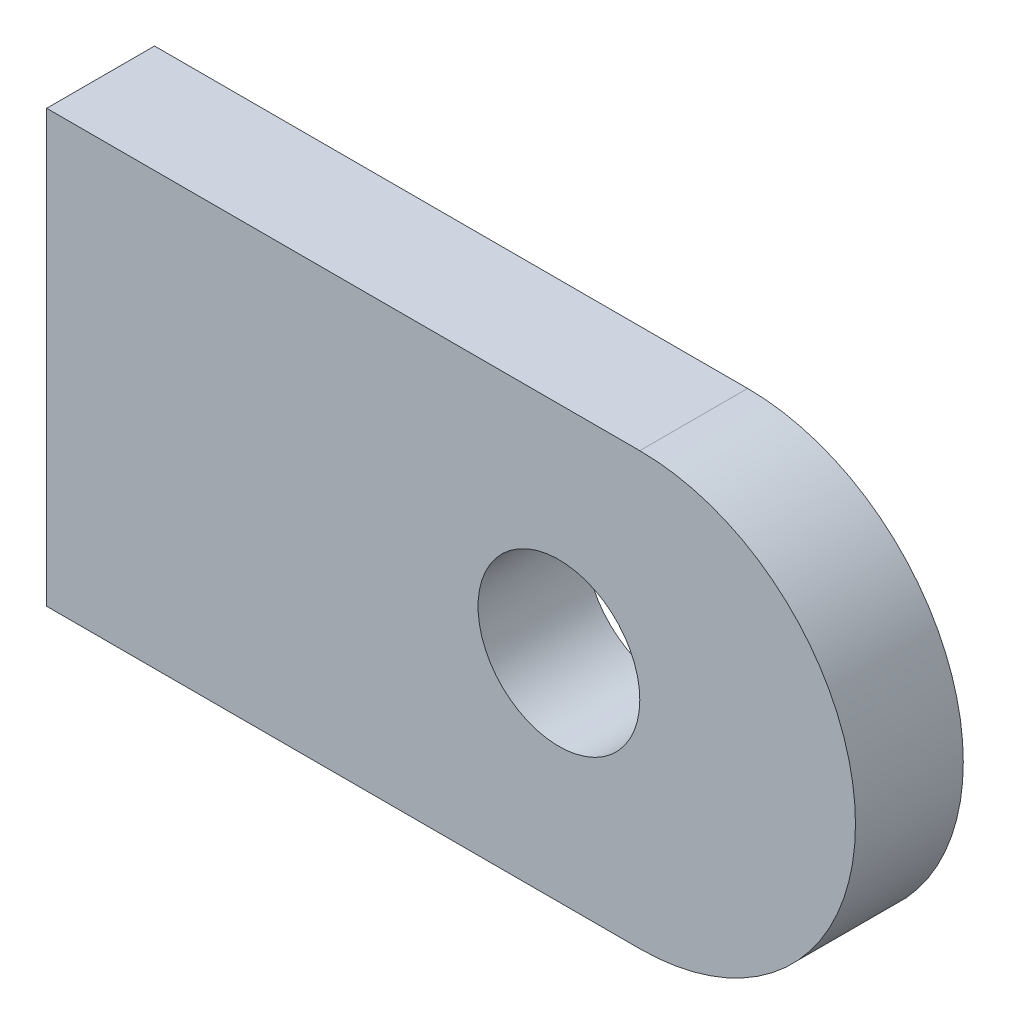
ISO-10303-21;
HEADER;
FILE_DESCRIPTION(('STEP AP214'),'2;1');
FILE_NAME('part.step','',(''),(''),'','','');
FILE_SCHEMA(('AUTOMOTIVE_DESIGN { 1 0 10303 214 1 1 1 1 }'));
ENDSEC;
DATA;
#1=APPLICATION_CONTEXT('core data for automotive mechanical design processes');
#2=APPLICATION_PROTOCOL_DEFINITION('international standard','automotive_design',2000,#1);
#3=PRODUCT_CONTEXT('',#1,'mechanical');
#4=PRODUCT('Part','Part','',(#3));
#5=PRODUCT_RELATED_PRODUCT_CATEGORY('part','',(#4));
#6=PRODUCT_DEFINITION_FORMATION('','',#4);
#7=PRODUCT_DEFINITION_CONTEXT('part definition',#1,'design');
#8=PRODUCT_DEFINITION('design','',#6,#7);
#9=PRODUCT_DEFINITION_SHAPE('','',#8);
#10=(LENGTH_UNIT() NAMED_UNIT(*) SI_UNIT(.MILLI.,.METRE.));
#11=(NAMED_UNIT(*) PLANE_ANGLE_UNIT() SI_UNIT($,.RADIAN.));
#12=(NAMED_UNIT(*) SI_UNIT($,.STERADIAN.) SOLID_ANGLE_UNIT());
#13=UNCERTAINTY_MEASURE_WITH_UNIT(LENGTH_MEASURE(1.E-05),#10,'distance_accuracy_value','');
#14=(GEOMETRIC_REPRESENTATION_CONTEXT(3) GLOBAL_UNCERTAINTY_ASSIGNED_CONTEXT((#13)) GLOBAL_UNIT_ASSIGNED_CONTEXT((#10,
#11,#12)) REPRESENTATION_CONTEXT('',''));
#15=CARTESIAN_POINT('',(0.,0.,0.));
#16=DIRECTION('',(0.,0.,1.));
#17=DIRECTION('',(1.,0.,0.));
#18=AXIS2_PLACEMENT_3D('',#15,#16,#17);
#19=CARTESIAN_POINT('',(0.,-200.,100.));
#20=DIRECTION('',(0.,-1.,0.));
#21=DIRECTION('',(1.,0.,0.));
#22=AXIS2_PLACEMENT_3D('',#19,#20,#21);
#23=PLANE('',#22);
#24=DIRECTION('',(-1.,0.,0.));
#25=VECTOR('',#24,1.);
#26=CARTESIAN_POINT('',(0.,-200.,0.));
#27=LINE('',#26,#25);
#28=CARTESIAN_POINT('',(275.,-200.,0.));
#29=VERTEX_POINT('',#28);
#30=CARTESIAN_POINT('',(-275.,-200.,0.));
#31=VERTEX_POINT('',#30);
#32=EDGE_CURVE('E121',#29,#31,#27,.T.);
#33=ORIENTED_EDGE('',*,*,#32,.F.);
#34=DIRECTION('',(0.,0.,-1.));
#35=VECTOR('',#34,1.);
#36=CARTESIAN_POINT('',(275.,-200.,100.));
#37=LINE('',#36,#35);
#38=CARTESIAN_POINT('',(275.,-200.,100.));
#39=VERTEX_POINT('',#38);
#40=EDGE_CURVE('E11',#39,#29,#37,.T.);
#41=ORIENTED_EDGE('',*,*,#40,.F.);
#42=DIRECTION('',(-1.,0.,0.));
#43=VECTOR('',#42,1.);
#44=CARTESIAN_POINT('',(0.,-200.,100.));
#45=LINE('',#44,#43);
#46=CARTESIAN_POINT('',(-275.,-200.,100.));
#47=VERTEX_POINT('',#46);
#48=EDGE_CURVE('E107',#39,#47,#45,.T.);
#49=ORIENTED_EDGE('',*,*,#48,.T.);
#50=DIRECTION('',(0.,0.,-1.));
#51=VECTOR('',#50,1.);
#52=CARTESIAN_POINT('',(-275.,-200.,100.));
#53=LINE('',#52,#51);
#54=EDGE_CURVE('E63',#47,#31,#53,.T.);
#55=ORIENTED_EDGE('',*,*,#54,.T.);
#56=EDGE_LOOP('',(#33,#41,#49,#55));
#57=FACE_BOUND('',#56,.T.);
#58=ADVANCED_FACE('F45',(#57),#23,.T.);
#59=CARTESIAN_POINT('',(275.,0.,100.));
#60=DIRECTION('',(0.,0.,-1.));
#61=DIRECTION('',(-1.,0.,0.));
#62=AXIS2_PLACEMENT_3D('',#59,#60,#61);
#63=CYLINDRICAL_SURFACE('',#62,200.);
#64=CARTESIAN_POINT('',(275.,0.,0.));
#65=DIRECTION('',(0.,0.,1.));
#66=DIRECTION('',(1.,0.,0.));
#67=AXIS2_PLACEMENT_3D('',#64,#65,#66);
#68=CIRCLE('',#67,200.);
#69=CARTESIAN_POINT('',(275.,200.,0.));
#70=VERTEX_POINT('',#69);
#71=EDGE_CURVE('E95',#70,#29,#68,.F.);
#72=ORIENTED_EDGE('',*,*,#71,.F.);
#73=DIRECTION('',(0.,0.,-1.));
#74=VECTOR('',#73,1.);
#75=CARTESIAN_POINT('',(275.,200.,100.));
#76=LINE('',#75,#74);
#77=CARTESIAN_POINT('',(275.,200.,100.));
#78=VERTEX_POINT('',#77);
#79=EDGE_CURVE('E55',#78,#70,#76,.T.);
#80=ORIENTED_EDGE('',*,*,#79,.F.);
#81=CARTESIAN_POINT('',(275.,0.,100.));
#82=DIRECTION('',(0.,0.,1.));
#83=DIRECTION('',(1.,0.,0.));
#84=AXIS2_PLACEMENT_3D('',#81,#82,#83);
#85=CIRCLE('',#84,200.);
#86=EDGE_CURVE('E93',#78,#39,#85,.F.);
#87=ORIENTED_EDGE('',*,*,#86,.T.);
#88=ORIENTED_EDGE('',*,*,#40,.T.);
#89=EDGE_LOOP('',(#72,#80,#87,#88));
#90=FACE_BOUND('',#89,.T.);
#91=ADVANCED_FACE('F91',(#90),#63,.T.);
#92=CARTESIAN_POINT('',(0.,200.,100.));
#93=DIRECTION('',(0.,-1.,0.));
#94=DIRECTION('',(1.,0.,0.));
#95=AXIS2_PLACEMENT_3D('',#92,#93,#94);
#96=PLANE('',#95);
#97=DIRECTION('',(-1.,0.,0.));
#98=VECTOR('',#97,1.);
#99=CARTESIAN_POINT('',(0.,200.,0.));
#100=LINE('',#99,#98);
#101=CARTESIAN_POINT('',(-275.,200.,0.));
#102=VERTEX_POINT('',#101);
#103=EDGE_CURVE('E126',#70,#102,#100,.T.);
#104=ORIENTED_EDGE('',*,*,#103,.T.);
#105=DIRECTION('',(0.,0.,-1.));
#106=VECTOR('',#105,1.);
#107=CARTESIAN_POINT('',(-275.,200.,100.));
#108=LINE('',#107,#106);
#109=CARTESIAN_POINT('',(-275.,200.,100.));
#110=VERTEX_POINT('',#109);
#111=EDGE_CURVE('E77',#110,#102,#108,.T.);
#112=ORIENTED_EDGE('',*,*,#111,.F.);
#113=DIRECTION('',(-1.,0.,0.));
#114=VECTOR('',#113,1.);
#115=CARTESIAN_POINT('',(0.,200.,100.));
#116=LINE('',#115,#114);
#117=EDGE_CURVE('E99',#78,#110,#116,.T.);
#118=ORIENTED_EDGE('',*,*,#117,.F.);
#119=ORIENTED_EDGE('',*,*,#79,.T.);
#120=EDGE_LOOP('',(#104,#112,#118,#119));
#121=FACE_BOUND('',#120,.T.);
#122=ADVANCED_FACE('F100',(#121),#96,.F.);
#123=CARTESIAN_POINT('',(200.,0.,100.));
#124=DIRECTION('',(0.,0.,-1.));
#125=DIRECTION('',(-1.,0.,0.));
#126=AXIS2_PLACEMENT_3D('',#123,#124,#125);
#127=CYLINDRICAL_SURFACE('',#126,75.);
#128=CARTESIAN_POINT('',(200.,0.,100.));
#129=DIRECTION('',(0.,0.,1.));
#130=DIRECTION('',(1.,0.,0.));
#131=AXIS2_PLACEMENT_3D('',#128,#129,#130);
#132=CIRCLE('',#131,75.);
#133=CARTESIAN_POINT('',(275.,0.,100.));
#134=VERTEX_POINT('',#133);
#135=EDGE_CURVE('E111',#134,#134,#132,.T.);
#136=ORIENTED_EDGE('',*,*,#135,.T.);
#137=EDGE_LOOP('',(#136));
#138=FACE_BOUND('',#137,.T.);
#139=CARTESIAN_POINT('',(200.,0.,0.));
#140=DIRECTION('',(0.,0.,1.));
#141=DIRECTION('',(1.,0.,0.));
#142=AXIS2_PLACEMENT_3D('',#139,#140,#141);
#143=CIRCLE('',#142,75.);
#144=CARTESIAN_POINT('',(275.,0.,0.));
#145=VERTEX_POINT('',#144);
#146=EDGE_CURVE('E117',#145,#145,#143,.T.);
#147=ORIENTED_EDGE('',*,*,#146,.F.);
#148=EDGE_LOOP('',(#147));
#149=FACE_BOUND('',#148,.T.);
#150=ADVANCED_FACE('F47',(#138,#149),#127,.F.);
#151=CARTESIAN_POINT('',(-275.,0.,100.));
#152=DIRECTION('',(-1.,0.,0.));
#153=DIRECTION('',(0.,0.,1.));
#154=AXIS2_PLACEMENT_3D('',#151,#152,#153);
#155=PLANE('',#154);
#156=DIRECTION('',(0.,1.,0.));
#157=VECTOR('',#156,1.);
#158=CARTESIAN_POINT('',(-275.,0.,0.));
#159=LINE('',#158,#157);
#160=EDGE_CURVE('E129',#31,#102,#159,.T.);
#161=ORIENTED_EDGE('',*,*,#160,.F.);
#162=ORIENTED_EDGE('',*,*,#54,.F.);
#163=DIRECTION('',(0.,1.,0.));
#164=VECTOR('',#163,1.);
#165=CARTESIAN_POINT('',(-275.,0.,100.));
#166=LINE('',#165,#164);
#167=EDGE_CURVE('E104',#47,#110,#166,.T.);
#168=ORIENTED_EDGE('',*,*,#167,.T.);
#169=ORIENTED_EDGE('',*,*,#111,.T.);
#170=EDGE_LOOP('',(#161,#162,#168,#169));
#171=FACE_BOUND('',#170,.T.);
#172=ADVANCED_FACE('F145',(#171),#155,.T.);
#173=CARTESIAN_POINT('',(0.,0.,100.));
#174=DIRECTION('',(0.,0.,1.));
#175=DIRECTION('',(1.,0.,0.));
#176=AXIS2_PLACEMENT_3D('',#173,#174,#175);
#177=PLANE('',#176);
#178=ORIENTED_EDGE('',*,*,#135,.F.);
#179=EDGE_LOOP('',(#178));
#180=FACE_BOUND('',#179,.T.);
#181=ORIENTED_EDGE('',*,*,#48,.F.);
#182=ORIENTED_EDGE('',*,*,#86,.F.);
#183=ORIENTED_EDGE('',*,*,#117,.T.);
#184=ORIENTED_EDGE('',*,*,#167,.F.);
#185=EDGE_LOOP('',(#181,#182,#183,#184));
#186=FACE_BOUND('',#185,.T.);
#187=ADVANCED_FACE('F106',(#180,#186),#177,.T.);
#188=CARTESIAN_POINT('',(0.,0.,0.));
#189=DIRECTION('',(0.,0.,1.));
#190=DIRECTION('',(1.,0.,0.));
#191=AXIS2_PLACEMENT_3D('',#188,#189,#190);
#192=PLANE('',#191);
#193=ORIENTED_EDGE('',*,*,#146,.T.);
#194=EDGE_LOOP('',(#193));
#195=FACE_BOUND('',#194,.T.);
#196=ORIENTED_EDGE('',*,*,#32,.T.);
#197=ORIENTED_EDGE('',*,*,#160,.T.);
#198=ORIENTED_EDGE('',*,*,#103,.F.);
#199=ORIENTED_EDGE('',*,*,#71,.T.);
#200=EDGE_LOOP('',(#196,#197,#198,#199));
#201=FACE_BOUND('',#200,.T.);
#202=ADVANCED_FACE('F144',(#195,#201),#192,.F.);
#203=CLOSED_SHELL('',(#58,#91,#122,#150,#172,#187,#202));
#204=MANIFOLD_SOLID_BREP('B2',#203);
#205=ADVANCED_BREP_SHAPE_REPRESENTATION('',(#18,#204),#14);
#206=SHAPE_DEFINITION_REPRESENTATION(#9,#205);
ENDSEC;
END-ISO-10303-21;
